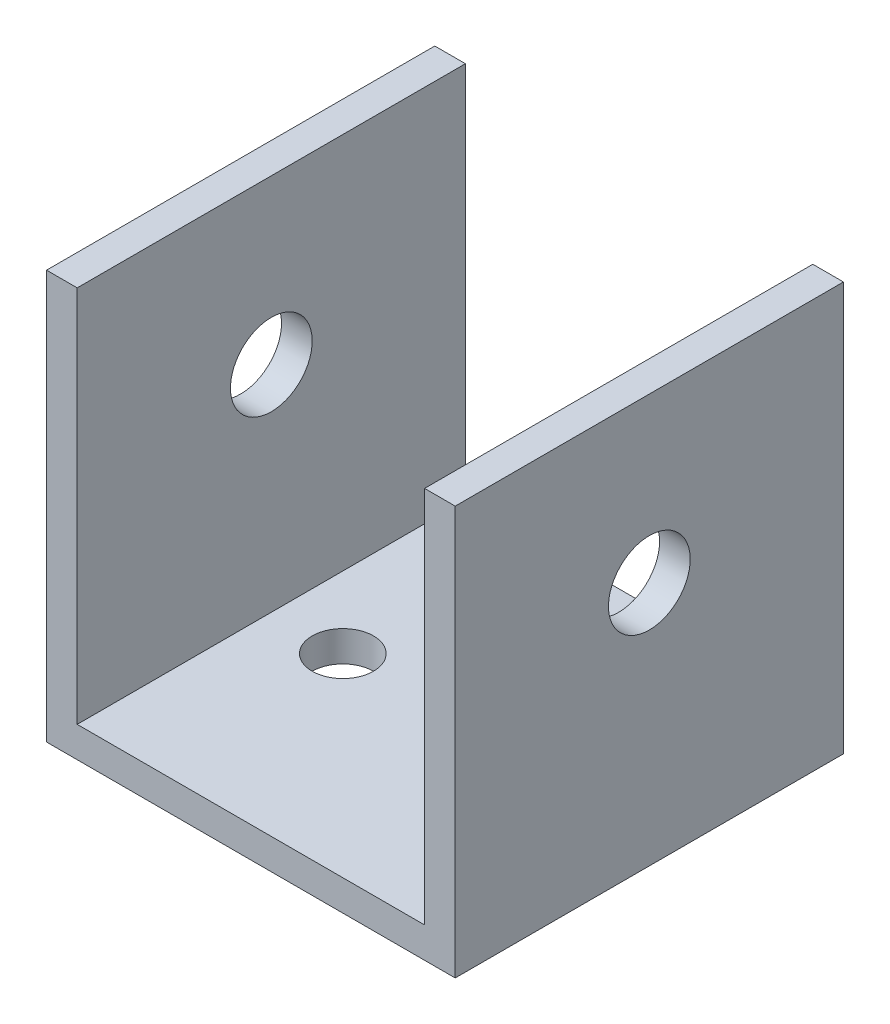
ISO-10303-21;
HEADER;
FILE_DESCRIPTION(('STEP AP214'),'2;1');
FILE_NAME('part.step','',(''),(''),'','','');
FILE_SCHEMA(('AUTOMOTIVE_DESIGN { 1 0 10303 214 1 1 1 1 }'));
ENDSEC;
DATA;
#1=APPLICATION_CONTEXT('core data for automotive mechanical design processes');
#2=APPLICATION_PROTOCOL_DEFINITION('international standard','automotive_design',2000,#1);
#3=PRODUCT_CONTEXT('',#1,'mechanical');
#4=PRODUCT('Part','Part','',(#3));
#5=PRODUCT_RELATED_PRODUCT_CATEGORY('part','',(#4));
#6=PRODUCT_DEFINITION_FORMATION('','',#4);
#7=PRODUCT_DEFINITION_CONTEXT('part definition',#1,'design');
#8=PRODUCT_DEFINITION('design','',#6,#7);
#9=PRODUCT_DEFINITION_SHAPE('','',#8);
#10=(LENGTH_UNIT() NAMED_UNIT(*) SI_UNIT(.MILLI.,.METRE.));
#11=(NAMED_UNIT(*) PLANE_ANGLE_UNIT() SI_UNIT($,.RADIAN.));
#12=(NAMED_UNIT(*) SI_UNIT($,.STERADIAN.) SOLID_ANGLE_UNIT());
#13=UNCERTAINTY_MEASURE_WITH_UNIT(LENGTH_MEASURE(1.E-05),#10,'distance_accuracy_value','');
#14=(GEOMETRIC_REPRESENTATION_CONTEXT(3) GLOBAL_UNCERTAINTY_ASSIGNED_CONTEXT((#13)) GLOBAL_UNIT_ASSIGNED_CONTEXT((#10,
#11,#12)) REPRESENTATION_CONTEXT('',''));
#15=CARTESIAN_POINT('',(0.,0.,0.));
#16=DIRECTION('',(0.,0.,1.));
#17=DIRECTION('',(1.,0.,0.));
#18=AXIS2_PLACEMENT_3D('',#15,#16,#17);
#19=CARTESIAN_POINT('',(20.2060662560441,-17.1120805155738,19.));
#20=DIRECTION('',(0.,-1.,0.));
#21=DIRECTION('',(0.,0.,-1.));
#22=AXIS2_PLACEMENT_3D('',#19,#20,#21);
#23=PLANE('',#22);
#24=DIRECTION('',(-1.,0.,0.));
#25=VECTOR('',#24,1.);
#26=CARTESIAN_POINT('',(20.2060662560441,-17.1120805155738,0.));
#27=LINE('',#26,#25);
#28=CARTESIAN_POINT('',(20.2060662560441,-17.1120805155738,0.));
#29=VERTEX_POINT('',#28);
#30=CARTESIAN_POINT('',(18.7060662560441,-17.1120805155738,0.));
#31=VERTEX_POINT('',#30);
#32=EDGE_CURVE('E129',#29,#31,#27,.T.);
#33=ORIENTED_EDGE('',*,*,#32,.T.);
#34=DIRECTION('',(0.,0.,-1.));
#35=VECTOR('',#34,1.);
#36=CARTESIAN_POINT('',(18.7060662560441,-17.1120805155738,19.));
#37=LINE('',#36,#35);
#38=CARTESIAN_POINT('',(18.7060662560441,-17.1120805155738,19.));
#39=VERTEX_POINT('',#38);
#40=EDGE_CURVE('E11',#39,#31,#37,.T.);
#41=ORIENTED_EDGE('',*,*,#40,.F.);
#42=DIRECTION('',(-1.,0.,0.));
#43=VECTOR('',#42,1.);
#44=CARTESIAN_POINT('',(20.2060662560441,-17.1120805155738,19.));
#45=LINE('',#44,#43);
#46=CARTESIAN_POINT('',(20.2060662560441,-17.1120805155738,19.));
#47=VERTEX_POINT('',#46);
#48=EDGE_CURVE('E144',#47,#39,#45,.T.);
#49=ORIENTED_EDGE('',*,*,#48,.F.);
#50=DIRECTION('',(0.,0.,-1.));
#51=VECTOR('',#50,1.);
#52=CARTESIAN_POINT('',(20.2060662560441,-17.1120805155738,19.));
#53=LINE('',#52,#51);
#54=EDGE_CURVE('E125',#47,#29,#53,.T.);
#55=ORIENTED_EDGE('',*,*,#54,.T.);
#56=EDGE_LOOP('',(#33,#41,#49,#55));
#57=FACE_BOUND('',#56,.T.);
#58=ADVANCED_FACE('F31',(#57),#23,.F.);
#59=CARTESIAN_POINT('',(18.7060662560441,-17.1120805155738,19.));
#60=DIRECTION('',(1.,0.,0.));
#61=DIRECTION('',(0.,1.,0.));
#62=AXIS2_PLACEMENT_3D('',#59,#60,#61);
#63=PLANE('',#62);
#64=CARTESIAN_POINT('',(18.7060662560441,-25.1120805155738,9.5));
#65=DIRECTION('',(-1.,0.,0.));
#66=DIRECTION('',(0.,-1.,0.));
#67=AXIS2_PLACEMENT_3D('',#64,#65,#66);
#68=CIRCLE('',#67,2.);
#69=CARTESIAN_POINT('',(18.7060662560441,-27.1120805155738,9.5));
#70=VERTEX_POINT('',#69);
#71=EDGE_CURVE('E334',#70,#70,#68,.T.);
#72=ORIENTED_EDGE('',*,*,#71,.F.);
#73=EDGE_LOOP('',(#72));
#74=FACE_BOUND('',#73,.T.);
#75=DIRECTION('',(0.,-1.,0.));
#76=VECTOR('',#75,1.);
#77=CARTESIAN_POINT('',(18.7060662560441,-17.1120805155738,0.));
#78=LINE('',#77,#76);
#79=CARTESIAN_POINT('',(18.7060662560441,-37.1120805155738,0.));
#80=VERTEX_POINT('',#79);
#81=EDGE_CURVE('E132',#31,#80,#78,.T.);
#82=ORIENTED_EDGE('',*,*,#81,.T.);
#83=DIRECTION('',(0.,0.,-1.));
#84=VECTOR('',#83,1.);
#85=CARTESIAN_POINT('',(18.7060662560441,-37.1120805155738,19.));
#86=LINE('',#85,#84);
#87=CARTESIAN_POINT('',(18.7060662560441,-37.1120805155738,19.));
#88=VERTEX_POINT('',#87);
#89=EDGE_CURVE('E40',#88,#80,#86,.T.);
#90=ORIENTED_EDGE('',*,*,#89,.F.);
#91=DIRECTION('',(0.,-1.,0.));
#92=VECTOR('',#91,1.);
#93=CARTESIAN_POINT('',(18.7060662560441,-17.1120805155738,19.));
#94=LINE('',#93,#92);
#95=EDGE_CURVE('E92',#39,#88,#94,.T.);
#96=ORIENTED_EDGE('',*,*,#95,.F.);
#97=ORIENTED_EDGE('',*,*,#40,.T.);
#98=EDGE_LOOP('',(#82,#90,#96,#97));
#99=FACE_BOUND('',#98,.T.);
#100=ADVANCED_FACE('F209',(#74,#99),#63,.F.);
#101=CARTESIAN_POINT('',(18.7060662560441,-37.1120805155738,19.));
#102=DIRECTION('',(0.,1.,0.));
#103=DIRECTION('',(0.,0.,1.));
#104=AXIS2_PLACEMENT_3D('',#101,#102,#103);
#105=PLANE('',#104);
#106=CARTESIAN_POINT('',(33.7060662560441,-37.1120805155738,9.5));
#107=DIRECTION('',(0.,-1.,0.));
#108=DIRECTION('',(0.,0.,-1.));
#109=AXIS2_PLACEMENT_3D('',#106,#107,#108);
#110=CIRCLE('',#109,1.5);
#111=CARTESIAN_POINT('',(33.7060662560441,-37.1120805155738,7.99999999999999));
#112=VERTEX_POINT('',#111);
#113=EDGE_CURVE('E160',#112,#112,#110,.T.);
#114=ORIENTED_EDGE('',*,*,#113,.F.);
#115=EDGE_LOOP('',(#114));
#116=FACE_BOUND('',#115,.T.);
#117=CARTESIAN_POINT('',(23.7060662560441,-37.1120805155738,9.5));
#118=DIRECTION('',(0.,-1.,0.));
#119=DIRECTION('',(0.,0.,-1.));
#120=AXIS2_PLACEMENT_3D('',#117,#118,#119);
#121=CIRCLE('',#120,1.5);
#122=CARTESIAN_POINT('',(23.7060662560441,-37.1120805155738,8.));
#123=VERTEX_POINT('',#122);
#124=EDGE_CURVE('E157',#123,#123,#121,.T.);
#125=ORIENTED_EDGE('',*,*,#124,.F.);
#126=EDGE_LOOP('',(#125));
#127=FACE_BOUND('',#126,.T.);
#128=DIRECTION('',(1.,0.,0.));
#129=VECTOR('',#128,1.);
#130=CARTESIAN_POINT('',(18.7060662560441,-37.1120805155738,0.));
#131=LINE('',#130,#129);
#132=CARTESIAN_POINT('',(38.7060662560441,-37.1120805155738,0.));
#133=VERTEX_POINT('',#132);
#134=EDGE_CURVE('E135',#80,#133,#131,.T.);
#135=ORIENTED_EDGE('',*,*,#134,.T.);
#136=DIRECTION('',(0.,0.,-1.));
#137=VECTOR('',#136,1.);
#138=CARTESIAN_POINT('',(38.7060662560441,-37.1120805155738,19.));
#139=LINE('',#138,#137);
#140=CARTESIAN_POINT('',(38.7060662560441,-37.1120805155738,19.));
#141=VERTEX_POINT('',#140);
#142=EDGE_CURVE('E151',#141,#133,#139,.T.);
#143=ORIENTED_EDGE('',*,*,#142,.F.);
#144=DIRECTION('',(1.,0.,0.));
#145=VECTOR('',#144,1.);
#146=CARTESIAN_POINT('',(18.7060662560441,-37.1120805155738,19.));
#147=LINE('',#146,#145);
#148=EDGE_CURVE('E176',#88,#141,#147,.T.);
#149=ORIENTED_EDGE('',*,*,#148,.F.);
#150=ORIENTED_EDGE('',*,*,#89,.T.);
#151=EDGE_LOOP('',(#135,#143,#149,#150));
#152=FACE_BOUND('',#151,.T.);
#153=ADVANCED_FACE('F213',(#116,#127,#152),#105,.F.);
#154=CARTESIAN_POINT('',(38.7060662560441,-37.1120805155738,19.));
#155=DIRECTION('',(-1.,0.,0.));
#156=DIRECTION('',(0.,0.,1.));
#157=AXIS2_PLACEMENT_3D('',#154,#155,#156);
#158=PLANE('',#157);
#159=CARTESIAN_POINT('',(38.7060662560441,-25.1120805155738,9.5));
#160=DIRECTION('',(-1.,0.,0.));
#161=DIRECTION('',(0.,-1.,0.));
#162=AXIS2_PLACEMENT_3D('',#159,#160,#161);
#163=CIRCLE('',#162,2.);
#164=CARTESIAN_POINT('',(38.7060662560441,-27.1120805155738,9.5));
#165=VERTEX_POINT('',#164);
#166=EDGE_CURVE('E333',#165,#165,#163,.T.);
#167=ORIENTED_EDGE('',*,*,#166,.T.);
#168=EDGE_LOOP('',(#167));
#169=FACE_BOUND('',#168,.T.);
#170=DIRECTION('',(0.,1.,0.));
#171=VECTOR('',#170,1.);
#172=CARTESIAN_POINT('',(38.7060662560441,-37.1120805155738,0.));
#173=LINE('',#172,#171);
#174=CARTESIAN_POINT('',(38.7060662560441,-17.1120805155738,0.));
#175=VERTEX_POINT('',#174);
#176=EDGE_CURVE('E137',#133,#175,#173,.T.);
#177=ORIENTED_EDGE('',*,*,#176,.T.);
#178=DIRECTION('',(0.,0.,-1.));
#179=VECTOR('',#178,1.);
#180=CARTESIAN_POINT('',(38.7060662560441,-17.1120805155738,19.));
#181=LINE('',#180,#179);
#182=CARTESIAN_POINT('',(38.7060662560441,-17.1120805155738,19.));
#183=VERTEX_POINT('',#182);
#184=EDGE_CURVE('E148',#183,#175,#181,.T.);
#185=ORIENTED_EDGE('',*,*,#184,.F.);
#186=DIRECTION('',(0.,1.,0.));
#187=VECTOR('',#186,1.);
#188=CARTESIAN_POINT('',(38.7060662560441,-37.1120805155738,19.));
#189=LINE('',#188,#187);
#190=EDGE_CURVE('E178',#141,#183,#189,.T.);
#191=ORIENTED_EDGE('',*,*,#190,.F.);
#192=ORIENTED_EDGE('',*,*,#142,.T.);
#193=EDGE_LOOP('',(#177,#185,#191,#192));
#194=FACE_BOUND('',#193,.T.);
#195=ADVANCED_FACE('F184',(#169,#194),#158,.F.);
#196=CARTESIAN_POINT('',(38.7060662560441,-17.1120805155738,19.));
#197=DIRECTION('',(0.,-1.,0.));
#198=DIRECTION('',(1.,0.,0.));
#199=AXIS2_PLACEMENT_3D('',#196,#197,#198);
#200=PLANE('',#199);
#201=DIRECTION('',(-1.,0.,0.));
#202=VECTOR('',#201,1.);
#203=CARTESIAN_POINT('',(38.7060662560441,-17.1120805155738,0.));
#204=LINE('',#203,#202);
#205=CARTESIAN_POINT('',(37.2060662560441,-17.1120805155738,0.));
#206=VERTEX_POINT('',#205);
#207=EDGE_CURVE('E139',#175,#206,#204,.T.);
#208=ORIENTED_EDGE('',*,*,#207,.T.);
#209=DIRECTION('',(0.,0.,-1.));
#210=VECTOR('',#209,1.);
#211=CARTESIAN_POINT('',(37.2060662560441,-17.1120805155738,19.));
#212=LINE('',#211,#210);
#213=CARTESIAN_POINT('',(37.2060662560441,-17.1120805155738,19.));
#214=VERTEX_POINT('',#213);
#215=EDGE_CURVE('E120',#214,#206,#212,.T.);
#216=ORIENTED_EDGE('',*,*,#215,.F.);
#217=DIRECTION('',(-1.,0.,0.));
#218=VECTOR('',#217,1.);
#219=CARTESIAN_POINT('',(38.7060662560441,-17.1120805155738,19.));
#220=LINE('',#219,#218);
#221=EDGE_CURVE('E111',#183,#214,#220,.T.);
#222=ORIENTED_EDGE('',*,*,#221,.F.);
#223=ORIENTED_EDGE('',*,*,#184,.T.);
#224=EDGE_LOOP('',(#208,#216,#222,#223));
#225=FACE_BOUND('',#224,.T.);
#226=ADVANCED_FACE('F188',(#225),#200,.F.);
#227=CARTESIAN_POINT('',(37.2060662560441,-17.1120805155738,19.));
#228=DIRECTION('',(1.,0.,0.));
#229=DIRECTION('',(0.,0.,-1.));
#230=AXIS2_PLACEMENT_3D('',#227,#228,#229);
#231=PLANE('',#230);
#232=CARTESIAN_POINT('',(37.2060662560441,-25.1120805155738,9.5));
#233=DIRECTION('',(1.,0.,0.));
#234=DIRECTION('',(0.,0.,-1.));
#235=AXIS2_PLACEMENT_3D('',#232,#233,#234);
#236=CIRCLE('',#235,2.);
#237=CARTESIAN_POINT('',(37.2060662560441,-25.1120805155738,7.5));
#238=VERTEX_POINT('',#237);
#239=EDGE_CURVE('E166',#238,#238,#236,.T.);
#240=ORIENTED_EDGE('',*,*,#239,.T.);
#241=EDGE_LOOP('',(#240));
#242=FACE_BOUND('',#241,.T.);
#243=DIRECTION('',(0.,-1.,0.));
#244=VECTOR('',#243,1.);
#245=CARTESIAN_POINT('',(37.2060662560441,-17.1120805155738,0.));
#246=LINE('',#245,#244);
#247=CARTESIAN_POINT('',(37.2060662560441,-35.6120805155738,0.));
#248=VERTEX_POINT('',#247);
#249=EDGE_CURVE('E119',#206,#248,#246,.T.);
#250=ORIENTED_EDGE('',*,*,#249,.T.);
#251=DIRECTION('',(0.,0.,-1.));
#252=VECTOR('',#251,1.);
#253=CARTESIAN_POINT('',(37.2060662560441,-35.6120805155738,19.));
#254=LINE('',#253,#252);
#255=CARTESIAN_POINT('',(37.2060662560441,-35.6120805155738,19.));
#256=VERTEX_POINT('',#255);
#257=EDGE_CURVE('E116',#256,#248,#254,.T.);
#258=ORIENTED_EDGE('',*,*,#257,.F.);
#259=DIRECTION('',(0.,-1.,0.));
#260=VECTOR('',#259,1.);
#261=CARTESIAN_POINT('',(37.2060662560441,-17.1120805155738,19.));
#262=LINE('',#261,#260);
#263=EDGE_CURVE('E105',#214,#256,#262,.T.);
#264=ORIENTED_EDGE('',*,*,#263,.F.);
#265=ORIENTED_EDGE('',*,*,#215,.T.);
#266=EDGE_LOOP('',(#250,#258,#264,#265));
#267=FACE_BOUND('',#266,.T.);
#268=ADVANCED_FACE('F117',(#242,#267),#231,.F.);
#269=CARTESIAN_POINT('',(37.2060662560441,-35.6120805155738,19.));
#270=DIRECTION('',(0.,-1.,0.));
#271=DIRECTION('',(0.,0.,-1.));
#272=AXIS2_PLACEMENT_3D('',#269,#270,#271);
#273=PLANE('',#272);
#274=CARTESIAN_POINT('',(33.7060662560441,-35.6120805155738,9.5));
#275=DIRECTION('',(0.,-1.,0.));
#276=DIRECTION('',(0.,0.,-1.));
#277=AXIS2_PLACEMENT_3D('',#274,#275,#276);
#278=CIRCLE('',#277,1.5);
#279=CARTESIAN_POINT('',(33.7060662560441,-35.6120805155738,7.99999999999999));
#280=VERTEX_POINT('',#279);
#281=EDGE_CURVE('E158',#280,#280,#278,.T.);
#282=ORIENTED_EDGE('',*,*,#281,.T.);
#283=EDGE_LOOP('',(#282));
#284=FACE_BOUND('',#283,.T.);
#285=CARTESIAN_POINT('',(23.7060662560441,-35.6120805155738,9.5));
#286=DIRECTION('',(0.,-1.,0.));
#287=DIRECTION('',(0.,0.,-1.));
#288=AXIS2_PLACEMENT_3D('',#285,#286,#287);
#289=CIRCLE('',#288,1.5);
#290=CARTESIAN_POINT('',(23.7060662560441,-35.6120805155738,8.));
#291=VERTEX_POINT('',#290);
#292=EDGE_CURVE('E133',#291,#291,#289,.T.);
#293=ORIENTED_EDGE('',*,*,#292,.T.);
#294=EDGE_LOOP('',(#293));
#295=FACE_BOUND('',#294,.T.);
#296=DIRECTION('',(-1.,0.,0.));
#297=VECTOR('',#296,1.);
#298=CARTESIAN_POINT('',(37.2060662560441,-35.6120805155738,0.));
#299=LINE('',#298,#297);
#300=CARTESIAN_POINT('',(20.2060662560441,-35.6120805155738,0.));
#301=VERTEX_POINT('',#300);
#302=EDGE_CURVE('E78',#248,#301,#299,.T.);
#303=ORIENTED_EDGE('',*,*,#302,.T.);
#304=DIRECTION('',(0.,0.,-1.));
#305=VECTOR('',#304,1.);
#306=CARTESIAN_POINT('',(20.2060662560441,-35.6120805155738,19.));
#307=LINE('',#306,#305);
#308=CARTESIAN_POINT('',(20.2060662560441,-35.6120805155738,19.));
#309=VERTEX_POINT('',#308);
#310=EDGE_CURVE('E121',#309,#301,#307,.T.);
#311=ORIENTED_EDGE('',*,*,#310,.F.);
#312=DIRECTION('',(-1.,0.,0.));
#313=VECTOR('',#312,1.);
#314=CARTESIAN_POINT('',(37.2060662560441,-35.6120805155738,19.));
#315=LINE('',#314,#313);
#316=EDGE_CURVE('E109',#256,#309,#315,.T.);
#317=ORIENTED_EDGE('',*,*,#316,.F.);
#318=ORIENTED_EDGE('',*,*,#257,.T.);
#319=EDGE_LOOP('',(#303,#311,#317,#318));
#320=FACE_BOUND('',#319,.T.);
#321=ADVANCED_FACE('F123',(#284,#295,#320),#273,.F.);
#322=CARTESIAN_POINT('',(20.2060662560441,-35.6120805155738,19.));
#323=DIRECTION('',(-1.,0.,0.));
#324=DIRECTION('',(0.,-1.,0.));
#325=AXIS2_PLACEMENT_3D('',#322,#323,#324);
#326=PLANE('',#325);
#327=CARTESIAN_POINT('',(20.2060662560441,-25.1120805155738,9.5));
#328=DIRECTION('',(-1.,0.,0.));
#329=DIRECTION('',(0.,-1.,0.));
#330=AXIS2_PLACEMENT_3D('',#327,#328,#329);
#331=CIRCLE('',#330,2.);
#332=CARTESIAN_POINT('',(20.2060662560441,-27.1120805155738,9.5));
#333=VERTEX_POINT('',#332);
#334=EDGE_CURVE('E34',#333,#333,#331,.T.);
#335=ORIENTED_EDGE('',*,*,#334,.T.);
#336=EDGE_LOOP('',(#335));
#337=FACE_BOUND('',#336,.T.);
#338=DIRECTION('',(0.,1.,0.));
#339=VECTOR('',#338,1.);
#340=CARTESIAN_POINT('',(20.2060662560441,-35.6120805155738,0.));
#341=LINE('',#340,#339);
#342=EDGE_CURVE('E84',#301,#29,#341,.T.);
#343=ORIENTED_EDGE('',*,*,#342,.T.);
#344=ORIENTED_EDGE('',*,*,#54,.F.);
#345=DIRECTION('',(0.,1.,0.));
#346=VECTOR('',#345,1.);
#347=CARTESIAN_POINT('',(20.2060662560441,-35.6120805155738,19.));
#348=LINE('',#347,#346);
#349=EDGE_CURVE('E49',#309,#47,#348,.T.);
#350=ORIENTED_EDGE('',*,*,#349,.F.);
#351=ORIENTED_EDGE('',*,*,#310,.T.);
#352=EDGE_LOOP('',(#343,#344,#350,#351));
#353=FACE_BOUND('',#352,.T.);
#354=ADVANCED_FACE('F196',(#337,#353),#326,.F.);
#355=CARTESIAN_POINT('',(18.7060662560441,-17.1120805155738,19.));
#356=DIRECTION('',(0.,0.,1.));
#357=DIRECTION('',(1.,0.,0.));
#358=AXIS2_PLACEMENT_3D('',#355,#356,#357);
#359=PLANE('',#358);
#360=ORIENTED_EDGE('',*,*,#48,.T.);
#361=ORIENTED_EDGE('',*,*,#95,.T.);
#362=ORIENTED_EDGE('',*,*,#148,.T.);
#363=ORIENTED_EDGE('',*,*,#190,.T.);
#364=ORIENTED_EDGE('',*,*,#221,.T.);
#365=ORIENTED_EDGE('',*,*,#263,.T.);
#366=ORIENTED_EDGE('',*,*,#316,.T.);
#367=ORIENTED_EDGE('',*,*,#349,.T.);
#368=EDGE_LOOP('',(#360,#361,#362,#363,#364,#365,#366,#367));
#369=FACE_BOUND('',#368,.T.);
#370=ADVANCED_FACE('F107',(#369),#359,.T.);
#371=CARTESIAN_POINT('',(18.7060662560441,-17.1120805155738,0.));
#372=DIRECTION('',(0.,0.,1.));
#373=DIRECTION('',(1.,0.,0.));
#374=AXIS2_PLACEMENT_3D('',#371,#372,#373);
#375=PLANE('',#374);
#376=ORIENTED_EDGE('',*,*,#32,.F.);
#377=ORIENTED_EDGE('',*,*,#342,.F.);
#378=ORIENTED_EDGE('',*,*,#302,.F.);
#379=ORIENTED_EDGE('',*,*,#249,.F.);
#380=ORIENTED_EDGE('',*,*,#207,.F.);
#381=ORIENTED_EDGE('',*,*,#176,.F.);
#382=ORIENTED_EDGE('',*,*,#134,.F.);
#383=ORIENTED_EDGE('',*,*,#81,.F.);
#384=EDGE_LOOP('',(#376,#377,#378,#379,#380,#381,#382,#383));
#385=FACE_BOUND('',#384,.T.);
#386=ADVANCED_FACE('F191',(#385),#375,.F.);
#387=CARTESIAN_POINT('',(23.7060662560441,-32.1120805155738,9.5));
#388=DIRECTION('',(0.,-1.,0.));
#389=DIRECTION('',(0.,0.,-1.));
#390=AXIS2_PLACEMENT_3D('',#387,#388,#389);
#391=CYLINDRICAL_SURFACE('',#390,1.5);
#392=ORIENTED_EDGE('',*,*,#124,.T.);
#393=EDGE_LOOP('',(#392));
#394=FACE_BOUND('',#393,.T.);
#395=ORIENTED_EDGE('',*,*,#292,.F.);
#396=EDGE_LOOP('',(#395));
#397=FACE_BOUND('',#396,.T.);
#398=ADVANCED_FACE('F247',(#394,#397),#391,.F.);
#399=CARTESIAN_POINT('',(33.7060662560441,-32.1120805155738,9.5));
#400=DIRECTION('',(0.,-1.,0.));
#401=DIRECTION('',(0.,0.,-1.));
#402=AXIS2_PLACEMENT_3D('',#399,#400,#401);
#403=CYLINDRICAL_SURFACE('',#402,1.5);
#404=ORIENTED_EDGE('',*,*,#113,.T.);
#405=EDGE_LOOP('',(#404));
#406=FACE_BOUND('',#405,.T.);
#407=ORIENTED_EDGE('',*,*,#281,.F.);
#408=EDGE_LOOP('',(#407));
#409=FACE_BOUND('',#408,.T.);
#410=ADVANCED_FACE('F241',(#406,#409),#403,.F.);
#411=CARTESIAN_POINT('',(38.7060662560441,-25.1120805155738,9.5));
#412=DIRECTION('',(-1.,0.,0.));
#413=DIRECTION('',(0.,-1.,0.));
#414=AXIS2_PLACEMENT_3D('',#411,#412,#413);
#415=CYLINDRICAL_SURFACE('',#414,2.);
#416=ORIENTED_EDGE('',*,*,#71,.T.);
#417=EDGE_LOOP('',(#416));
#418=FACE_BOUND('',#417,.T.);
#419=ORIENTED_EDGE('',*,*,#334,.F.);
#420=EDGE_LOOP('',(#419));
#421=FACE_BOUND('',#420,.T.);
#422=ADVANCED_FACE('F235',(#418,#421),#415,.F.);
#423=ORIENTED_EDGE('',*,*,#166,.F.);
#424=EDGE_LOOP('',(#423));
#425=FACE_BOUND('',#424,.T.);
#426=ORIENTED_EDGE('',*,*,#239,.F.);
#427=EDGE_LOOP('',(#426));
#428=FACE_BOUND('',#427,.T.);
#429=ADVANCED_FACE('F233',(#425,#428),#415,.F.);
#430=CLOSED_SHELL('',(#58,#100,#153,#195,#226,#268,#321,#354,#370,#386,#398,#410,#422,#429));
#431=MANIFOLD_SOLID_BREP('B2',#430);
#432=ADVANCED_BREP_SHAPE_REPRESENTATION('',(#18,#431),#14);
#433=SHAPE_DEFINITION_REPRESENTATION(#9,#432);
ENDSEC;
END-ISO-10303-21;
